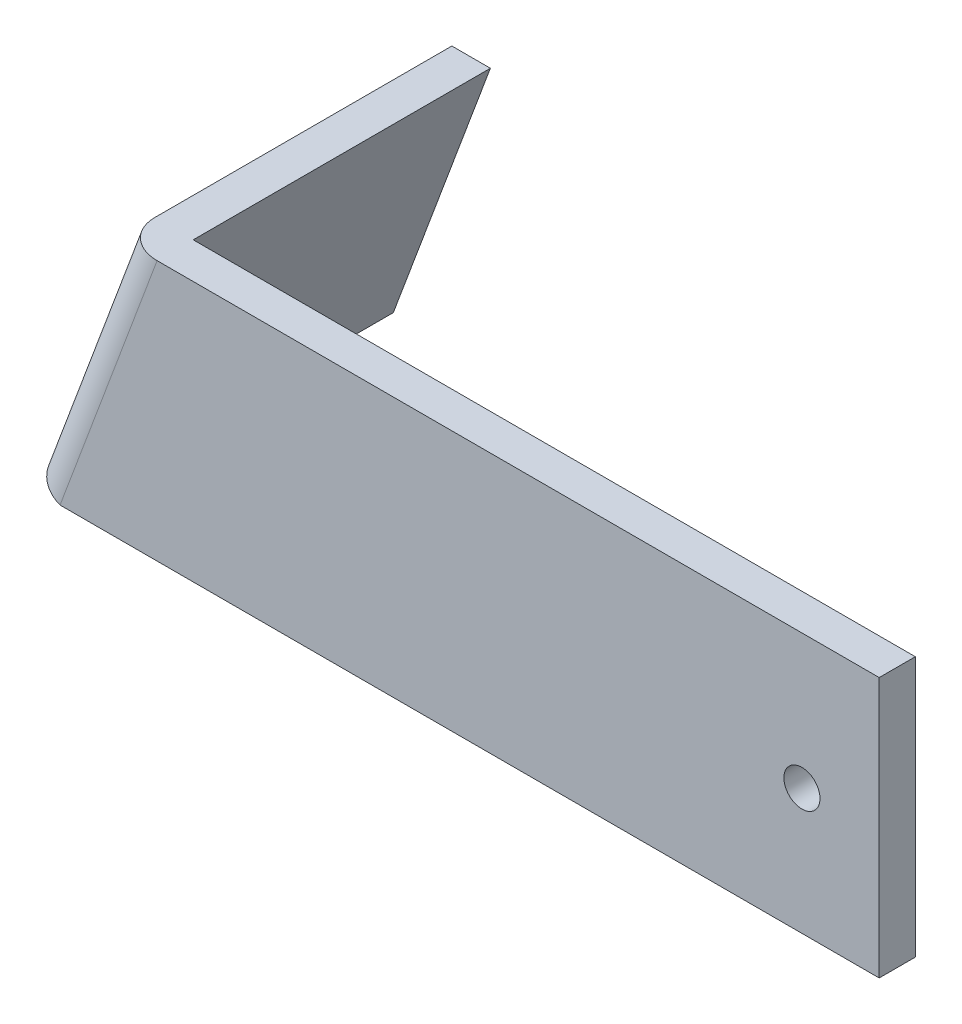
ISO-10303-21;
HEADER;
FILE_DESCRIPTION(('STEP AP214'),'2;1');
FILE_NAME('part.step','',(''),(''),'','','');
FILE_SCHEMA(('AUTOMOTIVE_DESIGN { 1 0 10303 214 1 1 1 1 }'));
ENDSEC;
DATA;
#1=APPLICATION_CONTEXT('core data for automotive mechanical design processes');
#2=APPLICATION_PROTOCOL_DEFINITION('international standard','automotive_design',2000,#1);
#3=PRODUCT_CONTEXT('',#1,'mechanical');
#4=PRODUCT('Part','Part','',(#3));
#5=PRODUCT_RELATED_PRODUCT_CATEGORY('part','',(#4));
#6=PRODUCT_DEFINITION_FORMATION('','',#4);
#7=PRODUCT_DEFINITION_CONTEXT('part definition',#1,'design');
#8=PRODUCT_DEFINITION('design','',#6,#7);
#9=PRODUCT_DEFINITION_SHAPE('','',#8);
#10=(LENGTH_UNIT() NAMED_UNIT(*) SI_UNIT(.MILLI.,.METRE.));
#11=(NAMED_UNIT(*) PLANE_ANGLE_UNIT() SI_UNIT($,.RADIAN.));
#12=(NAMED_UNIT(*) SI_UNIT($,.STERADIAN.) SOLID_ANGLE_UNIT());
#13=UNCERTAINTY_MEASURE_WITH_UNIT(LENGTH_MEASURE(1.E-05),#10,'distance_accuracy_value','');
#14=(GEOMETRIC_REPRESENTATION_CONTEXT(3) GLOBAL_UNCERTAINTY_ASSIGNED_CONTEXT((#13)) GLOBAL_UNIT_ASSIGNED_CONTEXT((#10,
#11,#12)) REPRESENTATION_CONTEXT('',''));
#15=CARTESIAN_POINT('',(0.,0.,0.));
#16=DIRECTION('',(0.,0.,1.));
#17=DIRECTION('',(1.,0.,0.));
#18=AXIS2_PLACEMENT_3D('',#15,#16,#17);
#19=CARTESIAN_POINT('',(-66.04,0.,-3.302));
#20=DIRECTION('',(0.,1.,0.));
#21=DIRECTION('',(0.,0.,1.));
#22=AXIS2_PLACEMENT_3D('',#19,#20,#21);
#23=PLANE('',#22);
#24=DIRECTION('',(-1.,0.,0.));
#25=VECTOR('',#24,1.);
#26=CARTESIAN_POINT('',(-66.04,0.,0.));
#27=LINE('',#26,#25);
#28=CARTESIAN_POINT('',(0.,0.,0.));
#29=VERTEX_POINT('',#28);
#30=CARTESIAN_POINT('',(-66.04,0.,0.));
#31=VERTEX_POINT('',#30);
#32=EDGE_CURVE('E128',#29,#31,#27,.T.);
#33=ORIENTED_EDGE('',*,*,#32,.F.);
#34=DIRECTION('',(0.,0.,1.));
#35=VECTOR('',#34,1.);
#36=CARTESIAN_POINT('',(0.,0.,-3.302));
#37=LINE('',#36,#35);
#38=CARTESIAN_POINT('',(0.,0.,-3.302));
#39=VERTEX_POINT('',#38);
#40=EDGE_CURVE('E11',#39,#29,#37,.T.);
#41=ORIENTED_EDGE('',*,*,#40,.F.);
#42=DIRECTION('',(-1.,0.,0.));
#43=VECTOR('',#42,1.);
#44=CARTESIAN_POINT('',(-66.04,0.,-3.302));
#45=LINE('',#44,#43);
#46=CARTESIAN_POINT('',(-66.04,0.,-3.302));
#47=VERTEX_POINT('',#46);
#48=EDGE_CURVE('E90',#39,#47,#45,.T.);
#49=ORIENTED_EDGE('',*,*,#48,.T.);
#50=DIRECTION('',(0.,0.,1.));
#51=VECTOR('',#50,1.);
#52=CARTESIAN_POINT('',(-66.04,0.,-3.302));
#53=LINE('',#52,#51);
#54=CARTESIAN_POINT('',(-66.04,0.,-30.48));
#55=VERTEX_POINT('',#54);
#56=EDGE_CURVE('E127',#55,#47,#53,.T.);
#57=ORIENTED_EDGE('',*,*,#56,.F.);
#58=DIRECTION('',(-1.,0.,0.));
#59=VECTOR('',#58,1.);
#60=CARTESIAN_POINT('',(-69.1336981239821,0.,-30.48));
#61=LINE('',#60,#59);
#62=CARTESIAN_POINT('',(-69.5643270555326,0.,-30.48));
#63=VERTEX_POINT('',#62);
#64=EDGE_CURVE('E157',#55,#63,#61,.T.);
#65=ORIENTED_EDGE('',*,*,#64,.T.);
#66=DIRECTION('',(0.,0.,1.));
#67=VECTOR('',#66,1.);
#68=CARTESIAN_POINT('',(-69.5643270555326,0.,-36.068));
#69=LINE('',#68,#67);
#70=CARTESIAN_POINT('',(-69.5643270555326,0.,-3.30199999999999));
#71=VERTEX_POINT('',#70);
#72=EDGE_CURVE('E151',#63,#71,#69,.T.);
#73=ORIENTED_EDGE('',*,*,#72,.T.);
#74=CARTESIAN_POINT('',(-66.04,0.,-3.302));
#75=DIRECTION('',(0.,-1.,0.));
#76=DIRECTION('',(-1.,0.,0.));
#77=AXIS2_PLACEMENT_3D('',#74,#75,#76);
#78=ELLIPSE('',#77,3.52432705553249,3.30199999999999);
#79=EDGE_CURVE('E123',#31,#71,#78,.T.);
#80=ORIENTED_EDGE('',*,*,#79,.F.);
#81=EDGE_LOOP('',(#33,#41,#49,#57,#65,#73,#80));
#82=FACE_BOUND('',#81,.T.);
#83=ADVANCED_FACE('F39',(#82),#23,.T.);
#84=CARTESIAN_POINT('',(0.,-23.7976778767849,-3.302));
#85=DIRECTION('',(1.,0.,0.));
#86=DIRECTION('',(0.,0.,-1.));
#87=AXIS2_PLACEMENT_3D('',#84,#85,#86);
#88=PLANE('',#87);
#89=DIRECTION('',(0.,1.,0.));
#90=VECTOR('',#89,1.);
#91=CARTESIAN_POINT('',(0.,-23.7976778767849,0.));
#92=LINE('',#91,#90);
#93=CARTESIAN_POINT('',(0.,-23.7976778767849,0.));
#94=VERTEX_POINT('',#93);
#95=EDGE_CURVE('E130',#94,#29,#92,.T.);
#96=ORIENTED_EDGE('',*,*,#95,.F.);
#97=DIRECTION('',(0.,0.,1.));
#98=VECTOR('',#97,1.);
#99=CARTESIAN_POINT('',(0.,-23.7976778767849,-3.302));
#100=LINE('',#99,#98);
#101=CARTESIAN_POINT('',(0.,-23.7976778767849,-3.302));
#102=VERTEX_POINT('',#101);
#103=EDGE_CURVE('E49',#102,#94,#100,.T.);
#104=ORIENTED_EDGE('',*,*,#103,.F.);
#105=DIRECTION('',(0.,1.,0.));
#106=VECTOR('',#105,1.);
#107=CARTESIAN_POINT('',(0.,-23.7976778767849,-3.302));
#108=LINE('',#107,#106);
#109=EDGE_CURVE('E100',#102,#39,#108,.T.);
#110=ORIENTED_EDGE('',*,*,#109,.T.);
#111=ORIENTED_EDGE('',*,*,#40,.T.);
#112=EDGE_LOOP('',(#96,#104,#110,#111));
#113=FACE_BOUND('',#112,.T.);
#114=ADVANCED_FACE('F191',(#113),#88,.T.);
#115=CARTESIAN_POINT('',(-74.9186557356835,-23.7976778767849,-3.302));
#116=DIRECTION('',(0.,-1.,0.));
#117=DIRECTION('',(1.,0.,0.));
#118=AXIS2_PLACEMENT_3D('',#115,#116,#117);
#119=PLANE('',#118);
#120=DIRECTION('',(1.,0.,0.));
#121=VECTOR('',#120,1.);
#122=CARTESIAN_POINT('',(-74.9186557356835,-23.7976778767849,0.));
#123=LINE('',#122,#121);
#124=CARTESIAN_POINT('',(-74.9186557356834,-23.7976778767849,0.));
#125=VERTEX_POINT('',#124);
#126=EDGE_CURVE('E85',#125,#94,#123,.T.);
#127=ORIENTED_EDGE('',*,*,#126,.F.);
#128=DIRECTION('',(0.,0.,1.));
#129=VECTOR('',#128,1.);
#130=CARTESIAN_POINT('',(-74.9186557356835,-23.7976778767849,-3.302));
#131=LINE('',#130,#129);
#132=CARTESIAN_POINT('',(-74.9186557356835,-23.7976778767849,-3.302));
#133=VERTEX_POINT('',#132);
#134=EDGE_CURVE('E43',#133,#125,#131,.T.);
#135=ORIENTED_EDGE('',*,*,#134,.F.);
#136=DIRECTION('',(1.,0.,0.));
#137=VECTOR('',#136,1.);
#138=CARTESIAN_POINT('',(-74.9186557356835,-23.7976778767849,-3.302));
#139=LINE('',#138,#137);
#140=EDGE_CURVE('E84',#133,#102,#139,.T.);
#141=ORIENTED_EDGE('',*,*,#140,.T.);
#142=ORIENTED_EDGE('',*,*,#103,.T.);
#143=EDGE_LOOP('',(#127,#135,#141,#142));
#144=FACE_BOUND('',#143,.T.);
#145=ADVANCED_FACE('F41',(#144),#119,.T.);
#146=CARTESIAN_POINT('',(0.,0.,-3.302));
#147=DIRECTION('',(0.,0.,1.));
#148=DIRECTION('',(1.,0.,0.));
#149=AXIS2_PLACEMENT_3D('',#146,#147,#148);
#150=PLANE('',#149);
#151=CARTESIAN_POINT('',(-7.06533984759036,-12.2967276653846,-3.302));
#152=DIRECTION('',(0.,0.,1.));
#153=DIRECTION('',(1.,0.,0.));
#154=AXIS2_PLACEMENT_3D('',#151,#152,#153);
#155=CIRCLE('',#154,1.651);
#156=CARTESIAN_POINT('',(-5.41433984759036,-12.2967276653846,-3.302));
#157=VERTEX_POINT('',#156);
#158=EDGE_CURVE('E139',#157,#157,#155,.T.);
#159=ORIENTED_EDGE('',*,*,#158,.T.);
#160=EDGE_LOOP('',(#159));
#161=FACE_BOUND('',#160,.T.);
#162=DIRECTION('',(-0.349553375420609,-0.936916451841923,0.));
#163=VECTOR('',#162,1.);
#164=CARTESIAN_POINT('',(-66.04,0.,-3.302));
#165=LINE('',#164,#163);
#166=EDGE_CURVE('E98',#47,#133,#165,.T.);
#167=ORIENTED_EDGE('',*,*,#166,.F.);
#168=ORIENTED_EDGE('',*,*,#48,.F.);
#169=ORIENTED_EDGE('',*,*,#109,.F.);
#170=ORIENTED_EDGE('',*,*,#140,.F.);
#171=EDGE_LOOP('',(#167,#168,#169,#170));
#172=FACE_BOUND('',#171,.T.);
#173=ADVANCED_FACE('F94',(#161,#172),#150,.F.);
#174=CARTESIAN_POINT('',(0.,0.,0.));
#175=DIRECTION('',(0.,0.,1.));
#176=DIRECTION('',(1.,0.,0.));
#177=AXIS2_PLACEMENT_3D('',#174,#175,#176);
#178=PLANE('',#177);
#179=CARTESIAN_POINT('',(-7.06533984759036,-12.2967276653846,0.));
#180=DIRECTION('',(0.,0.,1.));
#181=DIRECTION('',(1.,0.,0.));
#182=AXIS2_PLACEMENT_3D('',#179,#180,#181);
#183=CIRCLE('',#182,1.651);
#184=CARTESIAN_POINT('',(-5.41433984759036,-12.2967276653846,0.));
#185=VERTEX_POINT('',#184);
#186=EDGE_CURVE('E133',#185,#185,#183,.T.);
#187=ORIENTED_EDGE('',*,*,#186,.F.);
#188=EDGE_LOOP('',(#187));
#189=FACE_BOUND('',#188,.T.);
#190=DIRECTION('',(-0.349553375420609,-0.936916451841923,0.));
#191=VECTOR('',#190,1.);
#192=CARTESIAN_POINT('',(-66.04,0.,0.));
#193=LINE('',#192,#191);
#194=EDGE_CURVE('E76',#31,#125,#193,.T.);
#195=ORIENTED_EDGE('',*,*,#194,.T.);
#196=ORIENTED_EDGE('',*,*,#126,.T.);
#197=ORIENTED_EDGE('',*,*,#95,.T.);
#198=ORIENTED_EDGE('',*,*,#32,.T.);
#199=EDGE_LOOP('',(#195,#196,#197,#198));
#200=FACE_BOUND('',#199,.T.);
#201=ADVANCED_FACE('F142',(#189,#200),#178,.T.);
#202=CARTESIAN_POINT('',(-7.06533984759036,-12.2967276653846,-3.302));
#203=DIRECTION('',(0.,0.,1.));
#204=DIRECTION('',(1.,0.,0.));
#205=AXIS2_PLACEMENT_3D('',#202,#203,#204);
#206=CYLINDRICAL_SURFACE('',#205,1.651);
#207=CARTESIAN_POINT('',(-5.41433984759036,-12.2967276653846,-3.302));
#208=CARTESIAN_POINT('',(-5.41433984759036,-12.2967276653846,-3.26760416666667));
#209=CARTESIAN_POINT('',(-5.41433984759036,-12.2967276653846,-3.23320833333333));
#210=CARTESIAN_POINT('',(-5.41433984759036,-12.2967276653846,-3.16441666666667));
#211=CARTESIAN_POINT('',(-5.41433984759036,-12.2967276653846,-3.13002083333333));
#212=CARTESIAN_POINT('',(-5.41433984759036,-12.2967276653846,-3.06122916666667));
#213=CARTESIAN_POINT('',(-5.41433984759036,-12.2967276653846,-3.02683333333333));
#214=CARTESIAN_POINT('',(-5.41433984759036,-12.2967276653846,-2.95804166666667));
#215=CARTESIAN_POINT('',(-5.41433984759036,-12.2967276653846,-2.92364583333333));
#216=CARTESIAN_POINT('',(-5.41433984759036,-12.2967276653846,-2.85485416666667));
#217=CARTESIAN_POINT('',(-5.41433984759036,-12.2967276653846,-2.82045833333333));
#218=CARTESIAN_POINT('',(-5.41433984759036,-12.2967276653846,-2.75166666666667));
#219=CARTESIAN_POINT('',(-5.41433984759036,-12.2967276653846,-2.71727083333333));
#220=CARTESIAN_POINT('',(-5.41433984759036,-12.2967276653846,-2.64847916666667));
#221=CARTESIAN_POINT('',(-5.41433984759036,-12.2967276653846,-2.61408333333333));
#222=CARTESIAN_POINT('',(-5.41433984759036,-12.2967276653846,-2.54529166666667));
#223=CARTESIAN_POINT('',(-5.41433984759036,-12.2967276653846,-2.51089583333333));
#224=CARTESIAN_POINT('',(-5.41433984759036,-12.2967276653846,-2.44210416666667));
#225=CARTESIAN_POINT('',(-5.41433984759036,-12.2967276653846,-2.40770833333333));
#226=CARTESIAN_POINT('',(-5.41433984759036,-12.2967276653846,-2.33891666666667));
#227=CARTESIAN_POINT('',(-5.41433984759036,-12.2967276653846,-2.30452083333333));
#228=CARTESIAN_POINT('',(-5.41433984759036,-12.2967276653846,-2.23572916666667));
#229=CARTESIAN_POINT('',(-5.41433984759036,-12.2967276653846,-2.20133333333333));
#230=CARTESIAN_POINT('',(-5.41433984759036,-12.2967276653846,-2.13254166666667));
#231=CARTESIAN_POINT('',(-5.41433984759036,-12.2967276653846,-2.09814583333333));
#232=CARTESIAN_POINT('',(-5.41433984759036,-12.2967276653846,-2.02935416666667));
#233=CARTESIAN_POINT('',(-5.41433984759036,-12.2967276653846,-1.99495833333333));
#234=CARTESIAN_POINT('',(-5.41433984759036,-12.2967276653846,-1.92616666666667));
#235=CARTESIAN_POINT('',(-5.41433984759036,-12.2967276653846,-1.89177083333333));
#236=CARTESIAN_POINT('',(-5.41433984759036,-12.2967276653846,-1.82297916666667));
#237=CARTESIAN_POINT('',(-5.41433984759036,-12.2967276653846,-1.78858333333333));
#238=CARTESIAN_POINT('',(-5.41433984759036,-12.2967276653846,-1.71979166666667));
#239=CARTESIAN_POINT('',(-5.41433984759036,-12.2967276653846,-1.68539583333333));
#240=CARTESIAN_POINT('',(-5.41433984759036,-12.2967276653846,-1.61660416666667));
#241=CARTESIAN_POINT('',(-5.41433984759036,-12.2967276653846,-1.58220833333333));
#242=CARTESIAN_POINT('',(-5.41433984759036,-12.2967276653846,-1.51341666666667));
#243=CARTESIAN_POINT('',(-5.41433984759036,-12.2967276653846,-1.47902083333333));
#244=CARTESIAN_POINT('',(-5.41433984759036,-12.2967276653846,-1.41022916666667));
#245=CARTESIAN_POINT('',(-5.41433984759036,-12.2967276653846,-1.37583333333333));
#246=CARTESIAN_POINT('',(-5.41433984759036,-12.2967276653846,-1.30704166666667));
#247=CARTESIAN_POINT('',(-5.41433984759036,-12.2967276653846,-1.27264583333333));
#248=CARTESIAN_POINT('',(-5.41433984759036,-12.2967276653846,-1.20385416666667));
#249=CARTESIAN_POINT('',(-5.41433984759036,-12.2967276653846,-1.16945833333333));
#250=CARTESIAN_POINT('',(-5.41433984759036,-12.2967276653846,-1.10066666666667));
#251=CARTESIAN_POINT('',(-5.41433984759036,-12.2967276653846,-1.06627083333333));
#252=CARTESIAN_POINT('',(-5.41433984759036,-12.2967276653846,-0.997479166666667));
#253=CARTESIAN_POINT('',(-5.41433984759036,-12.2967276653846,-0.963083333333334));
#254=CARTESIAN_POINT('',(-5.41433984759036,-12.2967276653846,-0.894291666666667));
#255=CARTESIAN_POINT('',(-5.41433984759036,-12.2967276653846,-0.859895833333334));
#256=CARTESIAN_POINT('',(-5.41433984759036,-12.2967276653846,-0.791104166666667));
#257=CARTESIAN_POINT('',(-5.41433984759036,-12.2967276653846,-0.756708333333334));
#258=CARTESIAN_POINT('',(-5.41433984759036,-12.2967276653846,-0.687916666666667));
#259=CARTESIAN_POINT('',(-5.41433984759036,-12.2967276653846,-0.653520833333334));
#260=CARTESIAN_POINT('',(-5.41433984759036,-12.2967276653846,-0.584729166666667));
#261=CARTESIAN_POINT('',(-5.41433984759036,-12.2967276653846,-0.550333333333333));
#262=CARTESIAN_POINT('',(-5.41433984759036,-12.2967276653846,-0.481541666666667));
#263=CARTESIAN_POINT('',(-5.41433984759036,-12.2967276653846,-0.447145833333333));
#264=CARTESIAN_POINT('',(-5.41433984759036,-12.2967276653846,-0.378354166666667));
#265=CARTESIAN_POINT('',(-5.41433984759036,-12.2967276653846,-0.343958333333333));
#266=CARTESIAN_POINT('',(-5.41433984759036,-12.2967276653846,-0.275166666666667));
#267=CARTESIAN_POINT('',(-5.41433984759036,-12.2967276653846,-0.240770833333333));
#268=CARTESIAN_POINT('',(-5.41433984759036,-12.2967276653846,-0.171979166666667));
#269=CARTESIAN_POINT('',(-5.41433984759036,-12.2967276653846,-0.137583333333333));
#270=CARTESIAN_POINT('',(-5.41433984759036,-12.2967276653846,-0.0687916666666667));
#271=CARTESIAN_POINT('',(-5.41433984759036,-12.2967276653846,-0.0343958333333333));
#272=CARTESIAN_POINT('',(-5.41433984759036,-12.2967276653846,0.));
#273=B_SPLINE_CURVE_WITH_KNOTS('',3,(#207,#208,#209,#210,#211,#212,#213,#214,#215,#216,#217,
#218,#219,#220,#221,#222,#223,#224,#225,#226,#227,#228,#229,#230,#231,#232,#233,#234,#235,#236,
#237,#238,#239,#240,#241,#242,#243,#244,#245,#246,#247,#248,#249,#250,#251,#252,#253,#254,#255,
#256,#257,#258,#259,#260,#261,#262,#263,#264,#265,#266,#267,#268,#269,#270,#271,#272),
.UNSPECIFIED.,.F.,.F.,(4,2,2,2,2,2,2,2,2,2,2,2,2,2,2,2,2,2,2,2,2,2,2,2,2,2,2,2,2,2,2,2,4),(0.,
0.1031875,0.206375,0.3095625,0.41275,0.5159375,0.619125,0.7223125,0.8255,0.9286875,1.031875,
1.1350625,1.23825,1.3414375,1.444625,1.5478125,1.651,1.7541875,1.857375,1.9605625,2.06375,
2.1669375,2.270125,2.3733125,2.4765,2.5796875,2.682875,2.7860625,2.88925,2.9924375,3.095625,
3.1988125,3.302),.UNSPECIFIED.);
#274=EDGE_CURVE('BSEAM177',#157,#185,#273,.T.);
#275=ORIENTED_EDGE('',*,*,#158,.F.);
#276=ORIENTED_EDGE('',*,*,#186,.T.);
#277=ORIENTED_EDGE('',*,*,#274,.T.);
#278=ORIENTED_EDGE('',*,*,#274,.F.);
#279=EDGE_LOOP('',(#275,#277,#276,#278));
#280=FACE_BOUND('',#279,.T.);
#281=ADVANCED_FACE('F177',(#280),#206,.F.);
#282=CARTESIAN_POINT('',(-74.9186557356835,-23.7976778767849,-3.302));
#283=DIRECTION('',(-0.349553375420609,-0.936916451841923,0.));
#284=DIRECTION('',(0.936916451841923,-0.349553375420609,0.));
#285=AXIS2_PLACEMENT_3D('',#282,#283,#284);
#286=CYLINDRICAL_SURFACE('',#285,3.30199999999999);
#287=ORIENTED_EDGE('',*,*,#194,.F.);
#288=ORIENTED_EDGE('',*,*,#79,.T.);
#289=DIRECTION('',(-0.349553375420609,-0.936916451841923,0.));
#290=VECTOR('',#289,1.);
#291=CARTESIAN_POINT('',(-78.0123538596655,-22.643452631146,-3.30199999999999));
#292=LINE('',#291,#290);
#293=CARTESIAN_POINT('',(-78.0123538596655,-22.643452631146,-3.30199999999999));
#294=VERTEX_POINT('',#293);
#295=EDGE_CURVE('E162',#71,#294,#292,.T.);
#296=ORIENTED_EDGE('',*,*,#295,.T.);
#297=CARTESIAN_POINT('',(-74.9186557356835,-23.7976778767849,-3.302));
#298=DIRECTION('',(-0.349553375420609,-0.936916451841923,0.));
#299=DIRECTION('',(0.936916451841923,-0.349553375420609,0.));
#300=AXIS2_PLACEMENT_3D('',#297,#298,#299);
#301=CIRCLE('',#300,3.30199999999999);
#302=EDGE_CURVE('E106',#125,#294,#301,.T.);
#303=ORIENTED_EDGE('',*,*,#302,.F.);
#304=EDGE_LOOP('',(#287,#288,#296,#303));
#305=FACE_BOUND('',#304,.T.);
#306=ADVANCED_FACE('F185',(#305),#286,.T.);
#307=CARTESIAN_POINT('',(-74.9186557356834,-23.7976778767849,0.));
#308=DIRECTION('',(0.349553375420609,0.936916451841923,0.));
#309=DIRECTION('',(-0.936916451841923,0.349553375420609,0.));
#310=AXIS2_PLACEMENT_3D('',#307,#308,#309);
#311=PLANE('',#310);
#312=ORIENTED_EDGE('',*,*,#134,.T.);
#313=ORIENTED_EDGE('',*,*,#302,.T.);
#314=DIRECTION('',(0.936916451841923,-0.349553375420609,0.));
#315=VECTOR('',#314,1.);
#316=CARTESIAN_POINT('',(-78.0123538596655,-22.643452631146,-3.30199999999999));
#317=LINE('',#316,#315);
#318=EDGE_CURVE('E103',#294,#133,#317,.T.);
#319=ORIENTED_EDGE('',*,*,#318,.T.);
#320=EDGE_LOOP('',(#312,#313,#319));
#321=FACE_BOUND('',#320,.T.);
#322=ADVANCED_FACE('F105',(#321),#311,.F.);
#323=CARTESIAN_POINT('',(-69.1336981239821,1.15422524563888,-30.48));
#324=DIRECTION('',(0.,0.,-1.));
#325=DIRECTION('',(-1.,0.,0.));
#326=AXIS2_PLACEMENT_3D('',#323,#324,#325);
#327=PLANE('',#326);
#328=ORIENTED_EDGE('',*,*,#64,.F.);
#329=DIRECTION('',(0.349553375420609,0.936916451841923,0.));
#330=VECTOR('',#329,1.);
#331=CARTESIAN_POINT('',(-66.0400000000001,0.,-30.48));
#332=LINE('',#331,#330);
#333=CARTESIAN_POINT('',(-74.9186557356836,-23.7976778767848,-30.48));
#334=VERTEX_POINT('',#333);
#335=EDGE_CURVE('E122',#334,#55,#332,.T.);
#336=ORIENTED_EDGE('',*,*,#335,.F.);
#337=DIRECTION('',(0.936916451841923,-0.349553375420609,0.));
#338=VECTOR('',#337,1.);
#339=CARTESIAN_POINT('',(-78.0123538596656,-22.643452631146,-30.48));
#340=LINE('',#339,#338);
#341=CARTESIAN_POINT('',(-78.0123538596656,-22.643452631146,-30.48));
#342=VERTEX_POINT('',#341);
#343=EDGE_CURVE('E110',#342,#334,#340,.T.);
#344=ORIENTED_EDGE('',*,*,#343,.F.);
#345=DIRECTION('',(0.349553375420609,0.936916451841923,0.));
#346=VECTOR('',#345,1.);
#347=CARTESIAN_POINT('',(-69.1336981239821,1.15422524563888,-30.48));
#348=LINE('',#347,#346);
#349=EDGE_CURVE('E111',#342,#63,#348,.T.);
#350=ORIENTED_EDGE('',*,*,#349,.T.);
#351=EDGE_LOOP('',(#328,#336,#344,#350));
#352=FACE_BOUND('',#351,.T.);
#353=ADVANCED_FACE('F232',(#352),#327,.T.);
#354=CARTESIAN_POINT('',(-78.0123538596656,-22.643452631146,-30.48));
#355=DIRECTION('',(-0.349553375420609,-0.936916451841923,0.));
#356=DIRECTION('',(0.936916451841923,-0.349553375420609,0.));
#357=AXIS2_PLACEMENT_3D('',#354,#355,#356);
#358=PLANE('',#357);
#359=DIRECTION('',(0.,0.,-1.));
#360=VECTOR('',#359,1.);
#361=CARTESIAN_POINT('',(-74.9186557356836,-23.7976778767848,-30.48));
#362=LINE('',#361,#360);
#363=EDGE_CURVE('E115',#133,#334,#362,.T.);
#364=ORIENTED_EDGE('',*,*,#363,.F.);
#365=ORIENTED_EDGE('',*,*,#318,.F.);
#366=DIRECTION('',(0.,0.,-1.));
#367=VECTOR('',#366,1.);
#368=CARTESIAN_POINT('',(-78.0123538596656,-22.643452631146,-30.48));
#369=LINE('',#368,#367);
#370=EDGE_CURVE('E164',#294,#342,#369,.T.);
#371=ORIENTED_EDGE('',*,*,#370,.T.);
#372=ORIENTED_EDGE('',*,*,#343,.T.);
#373=EDGE_LOOP('',(#364,#365,#371,#372));
#374=FACE_BOUND('',#373,.T.);
#375=ADVANCED_FACE('F116',(#374),#358,.T.);
#376=CARTESIAN_POINT('',(-61.0644315118072,22.7824776810453,2.4634819230287E-13));
#377=DIRECTION('',(-0.936916451841923,0.349553375420609,0.));
#378=DIRECTION('',(-0.349553375420609,-0.936916451841923,0.));
#379=AXIS2_PLACEMENT_3D('',#376,#377,#378);
#380=PLANE('',#379);
#381=ORIENTED_EDGE('',*,*,#72,.F.);
#382=ORIENTED_EDGE('',*,*,#349,.F.);
#383=ORIENTED_EDGE('',*,*,#370,.F.);
#384=ORIENTED_EDGE('',*,*,#295,.F.);
#385=EDGE_LOOP('',(#381,#382,#383,#384));
#386=FACE_BOUND('',#385,.T.);
#387=ADVANCED_FACE('F245',(#386),#380,.T.);
#388=CARTESIAN_POINT('',(-57.9707333878252,21.6282524354065,2.3481932092201E-13));
#389=DIRECTION('',(-0.936916451841923,0.349553375420609,0.));
#390=DIRECTION('',(-0.349553375420609,-0.936916451841923,0.));
#391=AXIS2_PLACEMENT_3D('',#388,#389,#390);
#392=PLANE('',#391);
#393=ORIENTED_EDGE('',*,*,#166,.T.);
#394=ORIENTED_EDGE('',*,*,#363,.T.);
#395=ORIENTED_EDGE('',*,*,#335,.T.);
#396=ORIENTED_EDGE('',*,*,#56,.T.);
#397=EDGE_LOOP('',(#393,#394,#395,#396));
#398=FACE_BOUND('',#397,.T.);
#399=ADVANCED_FACE('F125',(#398),#392,.F.);
#400=CLOSED_SHELL('',(#83,#114,#145,#173,#201,#281,#306,#322,#353,#375,#387,#399));
#401=MANIFOLD_SOLID_BREP('B2',#400);
#402=ADVANCED_BREP_SHAPE_REPRESENTATION('',(#18,#401),#14);
#403=SHAPE_DEFINITION_REPRESENTATION(#9,#402);
ENDSEC;
END-ISO-10303-21;
